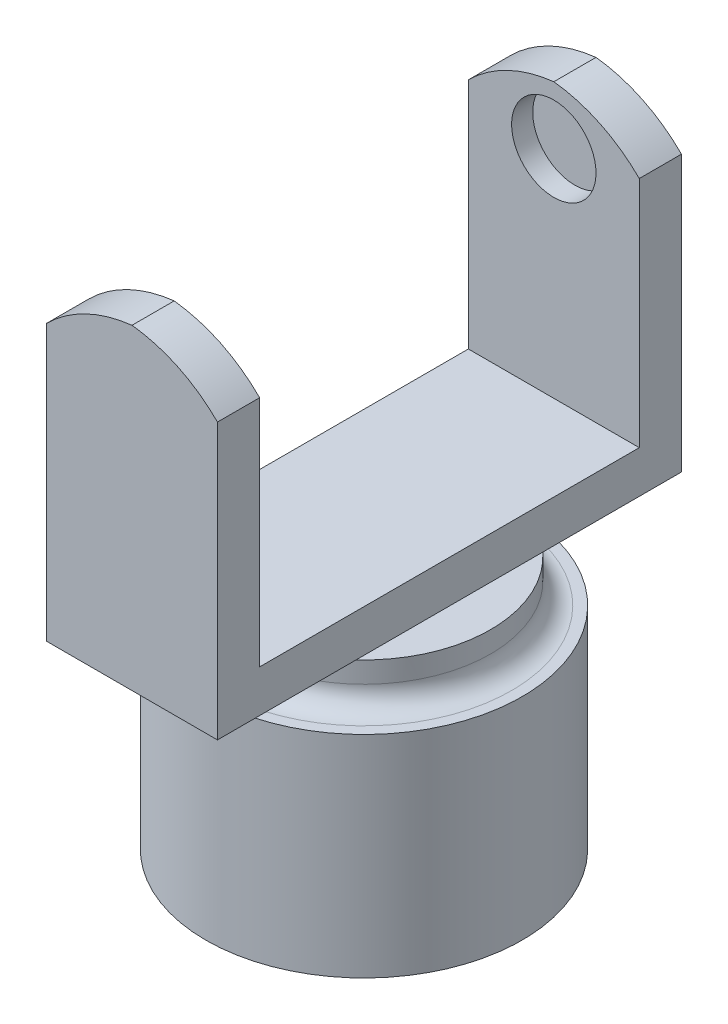
ISO-10303-21;
HEADER;
FILE_DESCRIPTION(('STEP AP214'),'2;1');
FILE_NAME('part.step','',(''),(''),'','','');
FILE_SCHEMA(('AUTOMOTIVE_DESIGN { 1 0 10303 214 1 1 1 1 }'));
ENDSEC;
DATA;
#1=APPLICATION_CONTEXT('core data for automotive mechanical design processes');
#2=APPLICATION_PROTOCOL_DEFINITION('international standard','automotive_design',2000,#1);
#3=PRODUCT_CONTEXT('',#1,'mechanical');
#4=PRODUCT('Part','Part','',(#3));
#5=PRODUCT_RELATED_PRODUCT_CATEGORY('part','',(#4));
#6=PRODUCT_DEFINITION_FORMATION('','',#4);
#7=PRODUCT_DEFINITION_CONTEXT('part definition',#1,'design');
#8=PRODUCT_DEFINITION('design','',#6,#7);
#9=PRODUCT_DEFINITION_SHAPE('','',#8);
#10=(LENGTH_UNIT() NAMED_UNIT(*) SI_UNIT(.MILLI.,.METRE.));
#11=(NAMED_UNIT(*) PLANE_ANGLE_UNIT() SI_UNIT($,.RADIAN.));
#12=(NAMED_UNIT(*) SI_UNIT($,.STERADIAN.) SOLID_ANGLE_UNIT());
#13=UNCERTAINTY_MEASURE_WITH_UNIT(LENGTH_MEASURE(1.E-05),#10,'distance_accuracy_value','');
#14=(GEOMETRIC_REPRESENTATION_CONTEXT(3) GLOBAL_UNCERTAINTY_ASSIGNED_CONTEXT((#13)) GLOBAL_UNIT_ASSIGNED_CONTEXT((#10,
#11,#12)) REPRESENTATION_CONTEXT('',''));
#15=CARTESIAN_POINT('',(0.,0.,0.));
#16=DIRECTION('',(0.,0.,1.));
#17=DIRECTION('',(1.,0.,0.));
#18=AXIS2_PLACEMENT_3D('',#15,#16,#17);
#19=CARTESIAN_POINT('',(-6.,27.,11.));
#20=DIRECTION('',(0.,0.,1.));
#21=DIRECTION('',(0.,-1.,0.));
#22=AXIS2_PLACEMENT_3D('',#19,#20,#21);
#23=PLANE('',#22);
#24=DIRECTION('',(1.,0.,0.));
#25=VECTOR('',#24,1.);
#26=CARTESIAN_POINT('',(-6.,12.,11.));
#27=LINE('',#26,#25);
#28=CARTESIAN_POINT('',(-4.05234317807465,12.,11.));
#29=VERTEX_POINT('',#28);
#30=CARTESIAN_POINT('',(4.05234317807465,12.,11.));
#31=VERTEX_POINT('',#30);
#32=EDGE_CURVE('E206',#29,#31,#27,.T.);
#33=ORIENTED_EDGE('',*,*,#32,.T.);
#34=DIRECTION('',(0.,1.,0.));
#35=VECTOR('',#34,1.);
#36=CARTESIAN_POINT('',(4.05234317807465,27.,11.));
#37=LINE('',#36,#35);
#38=CARTESIAN_POINT('',(4.05234317807465,25.0523431780746,11.));
#39=VERTEX_POINT('',#38);
#40=EDGE_CURVE('E248',#31,#39,#37,.T.);
#41=ORIENTED_EDGE('',*,*,#40,.T.);
#42=CARTESIAN_POINT('',(-0.750000000000014,20.25,11.));
#43=DIRECTION('',(0.,0.,1.));
#44=DIRECTION('',(1.,0.,0.));
#45=AXIS2_PLACEMENT_3D('',#42,#43,#44);
#46=CIRCLE('',#45,6.79153885360307);
#47=CARTESIAN_POINT('',(0.,27.,11.));
#48=VERTEX_POINT('',#47);
#49=EDGE_CURVE('E174',#48,#39,#46,.F.);
#50=ORIENTED_EDGE('',*,*,#49,.F.);
#51=CARTESIAN_POINT('',(0.750000000000014,20.25,11.));
#52=DIRECTION('',(0.,0.,1.));
#53=DIRECTION('',(1.,0.,0.));
#54=AXIS2_PLACEMENT_3D('',#51,#52,#53);
#55=CIRCLE('',#54,6.79153885360307);
#56=CARTESIAN_POINT('',(-4.05234317807465,25.0523431780746,11.));
#57=VERTEX_POINT('',#56);
#58=EDGE_CURVE('E188',#48,#57,#55,.T.);
#59=ORIENTED_EDGE('',*,*,#58,.T.);
#60=DIRECTION('',(0.,1.,0.));
#61=VECTOR('',#60,1.);
#62=CARTESIAN_POINT('',(-4.05234317807465,27.,11.));
#63=LINE('',#62,#61);
#64=EDGE_CURVE('E267',#29,#57,#63,.T.);
#65=ORIENTED_EDGE('',*,*,#64,.F.);
#66=EDGE_LOOP('',(#33,#41,#50,#59,#65));
#67=FACE_BOUND('',#66,.T.);
#68=ADVANCED_FACE('F56',(#67),#23,.T.);
#69=CARTESIAN_POINT('',(-6.,14.,9.));
#70=DIRECTION('',(0.,0.,-1.));
#71=DIRECTION('',(0.,1.,0.));
#72=AXIS2_PLACEMENT_3D('',#69,#70,#71);
#73=PLANE('',#72);
#74=CARTESIAN_POINT('',(0.,24.25,9.));
#75=DIRECTION('',(0.,0.,-1.));
#76=DIRECTION('',(0.,1.,0.));
#77=AXIS2_PLACEMENT_3D('',#74,#75,#76);
#78=CIRCLE('',#77,2.);
#79=CARTESIAN_POINT('',(0.,26.25,9.));
#80=VERTEX_POINT('',#79);
#81=EDGE_CURVE('E181',#80,#80,#78,.F.);
#82=ORIENTED_EDGE('',*,*,#81,.T.);
#83=EDGE_LOOP('',(#82));
#84=FACE_BOUND('',#83,.T.);
#85=CARTESIAN_POINT('',(-0.750000000000014,20.25,9.));
#86=DIRECTION('',(0.,0.,-1.));
#87=DIRECTION('',(0.,1.,0.));
#88=AXIS2_PLACEMENT_3D('',#85,#86,#87);
#89=CIRCLE('',#88,6.79153885360307);
#90=CARTESIAN_POINT('',(4.05234317807465,25.0523431780746,9.));
#91=VERTEX_POINT('',#90);
#92=CARTESIAN_POINT('',(0.,27.,9.00000000000001));
#93=VERTEX_POINT('',#92);
#94=EDGE_CURVE('E178',#91,#93,#89,.F.);
#95=ORIENTED_EDGE('',*,*,#94,.F.);
#96=DIRECTION('',(0.,-1.,0.));
#97=VECTOR('',#96,1.);
#98=CARTESIAN_POINT('',(4.05234317807465,14.,9.));
#99=LINE('',#98,#97);
#100=CARTESIAN_POINT('',(4.05234317807465,14.,9.));
#101=VERTEX_POINT('',#100);
#102=EDGE_CURVE('E79',#91,#101,#99,.T.);
#103=ORIENTED_EDGE('',*,*,#102,.T.);
#104=DIRECTION('',(1.,0.,0.));
#105=VECTOR('',#104,1.);
#106=CARTESIAN_POINT('',(-6.,14.,9.));
#107=LINE('',#106,#105);
#108=CARTESIAN_POINT('',(-4.05234317807465,14.,9.));
#109=VERTEX_POINT('',#108);
#110=EDGE_CURVE('E211',#109,#101,#107,.T.);
#111=ORIENTED_EDGE('',*,*,#110,.F.);
#112=DIRECTION('',(0.,-1.,0.));
#113=VECTOR('',#112,1.);
#114=CARTESIAN_POINT('',(-4.05234317807465,14.,9.));
#115=LINE('',#114,#113);
#116=CARTESIAN_POINT('',(-4.05234317807465,25.0523431780746,9.00000000000001));
#117=VERTEX_POINT('',#116);
#118=EDGE_CURVE('E270',#117,#109,#115,.T.);
#119=ORIENTED_EDGE('',*,*,#118,.F.);
#120=CARTESIAN_POINT('',(0.750000000000014,20.25,9.));
#121=DIRECTION('',(0.,0.,-1.));
#122=DIRECTION('',(0.,1.,0.));
#123=AXIS2_PLACEMENT_3D('',#120,#121,#122);
#124=CIRCLE('',#123,6.79153885360307);
#125=EDGE_CURVE('E202',#117,#93,#124,.T.);
#126=ORIENTED_EDGE('',*,*,#125,.T.);
#127=EDGE_LOOP('',(#95,#103,#111,#119,#126));
#128=FACE_BOUND('',#127,.T.);
#129=ADVANCED_FACE('F330',(#84,#128),#73,.T.);
#130=CARTESIAN_POINT('',(-6.,27.,-9.));
#131=DIRECTION('',(0.,0.,1.));
#132=DIRECTION('',(1.,0.,0.));
#133=AXIS2_PLACEMENT_3D('',#130,#131,#132);
#134=PLANE('',#133);
#135=CARTESIAN_POINT('',(0.,24.25,-9.));
#136=DIRECTION('',(0.,0.,1.));
#137=DIRECTION('',(1.,0.,0.));
#138=AXIS2_PLACEMENT_3D('',#135,#136,#137);
#139=CIRCLE('',#138,2.);
#140=CARTESIAN_POINT('',(2.,24.25,-9.));
#141=VERTEX_POINT('',#140);
#142=EDGE_CURVE('E242',#141,#141,#139,.F.);
#143=ORIENTED_EDGE('',*,*,#142,.T.);
#144=EDGE_LOOP('',(#143));
#145=FACE_BOUND('',#144,.T.);
#146=DIRECTION('',(1.,0.,0.));
#147=VECTOR('',#146,1.);
#148=CARTESIAN_POINT('',(-6.,14.,-9.));
#149=LINE('',#148,#147);
#150=CARTESIAN_POINT('',(-4.05234317807465,14.,-9.));
#151=VERTEX_POINT('',#150);
#152=CARTESIAN_POINT('',(4.05234317807465,14.,-9.));
#153=VERTEX_POINT('',#152);
#154=EDGE_CURVE('E215',#151,#153,#149,.T.);
#155=ORIENTED_EDGE('',*,*,#154,.T.);
#156=DIRECTION('',(0.,1.,0.));
#157=VECTOR('',#156,1.);
#158=CARTESIAN_POINT('',(4.05234317807465,27.,-9.));
#159=LINE('',#158,#157);
#160=CARTESIAN_POINT('',(4.05234317807465,25.0523431780746,-9.));
#161=VERTEX_POINT('',#160);
#162=EDGE_CURVE('E285',#153,#161,#159,.T.);
#163=ORIENTED_EDGE('',*,*,#162,.T.);
#164=CARTESIAN_POINT('',(-0.750000000000014,20.25,-9.));
#165=DIRECTION('',(0.,0.,1.));
#166=DIRECTION('',(1.,0.,0.));
#167=AXIS2_PLACEMENT_3D('',#164,#165,#166);
#168=CIRCLE('',#167,6.79153885360307);
#169=CARTESIAN_POINT('',(0.,27.,-9.));
#170=VERTEX_POINT('',#169);
#171=EDGE_CURVE('E166',#170,#161,#168,.F.);
#172=ORIENTED_EDGE('',*,*,#171,.F.);
#173=CARTESIAN_POINT('',(0.750000000000014,20.25,-9.));
#174=DIRECTION('',(0.,0.,1.));
#175=DIRECTION('',(1.,0.,0.));
#176=AXIS2_PLACEMENT_3D('',#173,#174,#175);
#177=CIRCLE('',#176,6.79153885360307);
#178=CARTESIAN_POINT('',(-4.05234317807465,25.0523431780746,-9.));
#179=VERTEX_POINT('',#178);
#180=EDGE_CURVE('E198',#170,#179,#177,.T.);
#181=ORIENTED_EDGE('',*,*,#180,.T.);
#182=DIRECTION('',(0.,1.,0.));
#183=VECTOR('',#182,1.);
#184=CARTESIAN_POINT('',(-4.05234317807465,27.,-9.));
#185=LINE('',#184,#183);
#186=EDGE_CURVE('E71',#151,#179,#185,.T.);
#187=ORIENTED_EDGE('',*,*,#186,.F.);
#188=EDGE_LOOP('',(#155,#163,#172,#181,#187));
#189=FACE_BOUND('',#188,.T.);
#190=ADVANCED_FACE('F357',(#145,#189),#134,.T.);
#191=CARTESIAN_POINT('',(-6.,12.,-11.));
#192=DIRECTION('',(0.,0.,-1.));
#193=DIRECTION('',(-1.,0.,0.));
#194=AXIS2_PLACEMENT_3D('',#191,#192,#193);
#195=PLANE('',#194);
#196=CARTESIAN_POINT('',(-0.750000000000014,20.25,-11.));
#197=DIRECTION('',(0.,0.,-1.));
#198=DIRECTION('',(-1.,0.,0.));
#199=AXIS2_PLACEMENT_3D('',#196,#197,#198);
#200=CIRCLE('',#199,6.79153885360307);
#201=CARTESIAN_POINT('',(4.05234317807465,25.0523431780746,-11.));
#202=VERTEX_POINT('',#201);
#203=CARTESIAN_POINT('',(0.,27.,-11.));
#204=VERTEX_POINT('',#203);
#205=EDGE_CURVE('E163',#202,#204,#200,.F.);
#206=ORIENTED_EDGE('',*,*,#205,.F.);
#207=DIRECTION('',(0.,-1.,0.));
#208=VECTOR('',#207,1.);
#209=CARTESIAN_POINT('',(4.05234317807465,0.,-11.));
#210=LINE('',#209,#208);
#211=CARTESIAN_POINT('',(4.05234317807465,12.,-11.));
#212=VERTEX_POINT('',#211);
#213=EDGE_CURVE('E143',#202,#212,#210,.T.);
#214=ORIENTED_EDGE('',*,*,#213,.T.);
#215=DIRECTION('',(1.,0.,0.));
#216=VECTOR('',#215,1.);
#217=CARTESIAN_POINT('',(-6.,12.,-11.));
#218=LINE('',#217,#216);
#219=CARTESIAN_POINT('',(-4.05234317807465,12.,-11.));
#220=VERTEX_POINT('',#219);
#221=EDGE_CURVE('E205',#220,#212,#218,.T.);
#222=ORIENTED_EDGE('',*,*,#221,.F.);
#223=DIRECTION('',(0.,-1.,0.));
#224=VECTOR('',#223,1.);
#225=CARTESIAN_POINT('',(-4.05234317807465,0.,-11.));
#226=LINE('',#225,#224);
#227=CARTESIAN_POINT('',(-4.05234317807465,25.0523431780746,-11.));
#228=VERTEX_POINT('',#227);
#229=EDGE_CURVE('E298',#228,#220,#226,.T.);
#230=ORIENTED_EDGE('',*,*,#229,.F.);
#231=CARTESIAN_POINT('',(0.750000000000014,20.25,-11.));
#232=DIRECTION('',(0.,0.,-1.));
#233=DIRECTION('',(-1.,0.,0.));
#234=AXIS2_PLACEMENT_3D('',#231,#232,#233);
#235=CIRCLE('',#234,6.79153885360307);
#236=EDGE_CURVE('E172',#228,#204,#235,.T.);
#237=ORIENTED_EDGE('',*,*,#236,.T.);
#238=EDGE_LOOP('',(#206,#214,#222,#230,#237));
#239=FACE_BOUND('',#238,.T.);
#240=ADVANCED_FACE('F169',(#239),#195,.T.);
#241=CARTESIAN_POINT('',(-6.,12.,-6.));
#242=DIRECTION('',(0.,-1.,0.));
#243=DIRECTION('',(0.,0.,-1.));
#244=AXIS2_PLACEMENT_3D('',#241,#242,#243);
#245=PLANE('',#244);
#246=ORIENTED_EDGE('',*,*,#221,.T.);
#247=DIRECTION('',(0.,0.,-1.));
#248=VECTOR('',#247,1.);
#249=CARTESIAN_POINT('',(4.05234317807465,12.,25.));
#250=LINE('',#249,#248);
#251=CARTESIAN_POINT('',(4.05234317807465,12.,-4.42476154918114));
#252=VERTEX_POINT('',#251);
#253=EDGE_CURVE('E151',#252,#212,#250,.T.);
#254=ORIENTED_EDGE('',*,*,#253,.F.);
#255=CARTESIAN_POINT('',(0.,12.,0.));
#256=DIRECTION('',(0.,1.,0.));
#257=DIRECTION('',(0.,0.,1.));
#258=AXIS2_PLACEMENT_3D('',#255,#256,#257);
#259=CIRCLE('',#258,6.);
#260=CARTESIAN_POINT('',(-4.05234317807465,12.,-4.42476154918114));
#261=VERTEX_POINT('',#260);
#262=EDGE_CURVE('E225',#252,#261,#259,.T.);
#263=ORIENTED_EDGE('',*,*,#262,.T.);
#264=DIRECTION('',(0.,0.,-1.));
#265=VECTOR('',#264,1.);
#266=CARTESIAN_POINT('',(-4.05234317807465,12.,25.));
#267=LINE('',#266,#265);
#268=EDGE_CURVE('E292',#261,#220,#267,.T.);
#269=ORIENTED_EDGE('',*,*,#268,.T.);
#270=EDGE_LOOP('',(#246,#254,#263,#269));
#271=FACE_BOUND('',#270,.T.);
#272=ADVANCED_FACE('F360',(#271),#245,.T.);
#273=CARTESIAN_POINT('',(-4.05234317807465,12.,4.42476154918114));
#274=VERTEX_POINT('',#273);
#275=CARTESIAN_POINT('',(4.05234317807465,12.,4.42476154918114));
#276=VERTEX_POINT('',#275);
#277=EDGE_CURVE('E210',#274,#276,#259,.T.);
#278=ORIENTED_EDGE('',*,*,#277,.T.);
#279=EDGE_CURVE('E277',#31,#276,#250,.T.);
#280=ORIENTED_EDGE('',*,*,#279,.F.);
#281=ORIENTED_EDGE('',*,*,#32,.F.);
#282=EDGE_CURVE('E157',#29,#274,#267,.T.);
#283=ORIENTED_EDGE('',*,*,#282,.T.);
#284=EDGE_LOOP('',(#278,#280,#281,#283));
#285=FACE_BOUND('',#284,.T.);
#286=ADVANCED_FACE('F275',(#285),#245,.T.);
#287=CARTESIAN_POINT('',(-6.,14.,-9.));
#288=DIRECTION('',(0.,1.,0.));
#289=DIRECTION('',(0.,0.,1.));
#290=AXIS2_PLACEMENT_3D('',#287,#288,#289);
#291=PLANE('',#290);
#292=ORIENTED_EDGE('',*,*,#110,.T.);
#293=DIRECTION('',(0.,0.,-1.));
#294=VECTOR('',#293,1.);
#295=CARTESIAN_POINT('',(4.05234317807465,14.,-9.));
#296=LINE('',#295,#294);
#297=EDGE_CURVE('E279',#101,#153,#296,.T.);
#298=ORIENTED_EDGE('',*,*,#297,.T.);
#299=ORIENTED_EDGE('',*,*,#154,.F.);
#300=DIRECTION('',(0.,0.,-1.));
#301=VECTOR('',#300,1.);
#302=CARTESIAN_POINT('',(-4.05234317807465,14.,-9.));
#303=LINE('',#302,#301);
#304=EDGE_CURVE('E258',#109,#151,#303,.T.);
#305=ORIENTED_EDGE('',*,*,#304,.F.);
#306=EDGE_LOOP('',(#292,#298,#299,#305));
#307=FACE_BOUND('',#306,.T.);
#308=ADVANCED_FACE('F363',(#307),#291,.T.);
#309=CARTESIAN_POINT('',(-0.750000000000014,20.25,-18.));
#310=DIRECTION('',(0.,0.,1.));
#311=DIRECTION('',(1.,0.,0.));
#312=AXIS2_PLACEMENT_3D('',#309,#310,#311);
#313=CYLINDRICAL_SURFACE('',#312,6.79153885360307);
#314=DIRECTION('',(0.,0.,-1.));
#315=VECTOR('',#314,1.);
#316=CARTESIAN_POINT('',(4.05234317807465,25.0523431780746,25.));
#317=LINE('',#316,#315);
#318=EDGE_CURVE('E147',#161,#202,#317,.T.);
#319=ORIENTED_EDGE('',*,*,#318,.T.);
#320=ORIENTED_EDGE('',*,*,#205,.T.);
#321=DIRECTION('',(0.,0.,1.));
#322=VECTOR('',#321,1.);
#323=CARTESIAN_POINT('',(0.,27.,-18.));
#324=LINE('',#323,#322);
#325=EDGE_CURVE('E195',#204,#170,#324,.T.);
#326=ORIENTED_EDGE('',*,*,#325,.T.);
#327=ORIENTED_EDGE('',*,*,#171,.T.);
#328=EDGE_LOOP('',(#319,#320,#326,#327));
#329=FACE_BOUND('',#328,.T.);
#330=ADVANCED_FACE('F162',(#329),#313,.T.);
#331=DIRECTION('',(0.,0.,1.));
#332=VECTOR('',#331,1.);
#333=CARTESIAN_POINT('',(4.05234317807465,25.0523431780746,-18.));
#334=LINE('',#333,#332);
#335=EDGE_CURVE('E65',#91,#39,#334,.T.);
#336=ORIENTED_EDGE('',*,*,#335,.F.);
#337=ORIENTED_EDGE('',*,*,#94,.T.);
#338=EDGE_CURVE('E192',#93,#48,#324,.T.);
#339=ORIENTED_EDGE('',*,*,#338,.T.);
#340=ORIENTED_EDGE('',*,*,#49,.T.);
#341=EDGE_LOOP('',(#336,#337,#339,#340));
#342=FACE_BOUND('',#341,.T.);
#343=ADVANCED_FACE('F260',(#342),#313,.T.);
#344=CARTESIAN_POINT('',(0.,10.,0.));
#345=DIRECTION('',(0.,-1.,0.));
#346=DIRECTION('',(0.,0.,-1.));
#347=AXIS2_PLACEMENT_3D('',#344,#345,#346);
#348=CYLINDRICAL_SURFACE('',#347,7.5);
#349=CARTESIAN_POINT('',(0.,10.,0.));
#350=DIRECTION('',(0.,1.,0.));
#351=DIRECTION('',(0.,0.,1.));
#352=AXIS2_PLACEMENT_3D('',#349,#350,#351);
#353=CIRCLE('',#352,7.5);
#354=CARTESIAN_POINT('',(0.,10.,7.5));
#355=VERTEX_POINT('',#354);
#356=EDGE_CURVE('E227',#355,#355,#353,.T.);
#357=ORIENTED_EDGE('',*,*,#356,.F.);
#358=EDGE_LOOP('',(#357));
#359=FACE_BOUND('',#358,.T.);
#360=CARTESIAN_POINT('',(0.,0.,0.));
#361=DIRECTION('',(0.,1.,0.));
#362=DIRECTION('',(0.,0.,1.));
#363=AXIS2_PLACEMENT_3D('',#360,#361,#362);
#364=CIRCLE('',#363,7.5);
#365=CARTESIAN_POINT('',(0.,0.,7.5));
#366=VERTEX_POINT('',#365);
#367=EDGE_CURVE('E224',#366,#366,#364,.T.);
#368=ORIENTED_EDGE('',*,*,#367,.T.);
#369=EDGE_LOOP('',(#368));
#370=FACE_BOUND('',#369,.T.);
#371=ADVANCED_FACE('F380',(#359,#370),#348,.T.);
#372=CARTESIAN_POINT('',(0.,10.,0.));
#373=DIRECTION('',(0.,1.,0.));
#374=DIRECTION('',(0.,0.,1.));
#375=AXIS2_PLACEMENT_3D('',#372,#373,#374);
#376=PLANE('',#375);
#377=CARTESIAN_POINT('',(0.,10.,0.));
#378=DIRECTION('',(0.,1.,0.));
#379=DIRECTION('',(0.,0.,1.));
#380=AXIS2_PLACEMENT_3D('',#377,#378,#379);
#381=CIRCLE('',#380,7.);
#382=CARTESIAN_POINT('',(0.,10.,7.));
#383=VERTEX_POINT('',#382);
#384=EDGE_CURVE('E238',#383,#383,#381,.F.);
#385=ORIENTED_EDGE('',*,*,#384,.T.);
#386=EDGE_LOOP('',(#385));
#387=FACE_BOUND('',#386,.T.);
#388=ORIENTED_EDGE('',*,*,#356,.T.);
#389=EDGE_LOOP('',(#388));
#390=FACE_BOUND('',#389,.T.);
#391=ADVANCED_FACE('F377',(#387,#390),#376,.T.);
#392=CARTESIAN_POINT('',(0.,0.,0.));
#393=DIRECTION('',(0.,1.,0.));
#394=DIRECTION('',(0.,0.,1.));
#395=AXIS2_PLACEMENT_3D('',#392,#393,#394);
#396=PLANE('',#395);
#397=CARTESIAN_POINT('',(0.,0.,0.));
#398=DIRECTION('',(0.,-1.,0.));
#399=DIRECTION('',(0.,0.,-1.));
#400=AXIS2_PLACEMENT_3D('',#397,#398,#399);
#401=CIRCLE('',#400,5.);
#402=CARTESIAN_POINT('',(0.,0.,-5.));
#403=VERTEX_POINT('',#402);
#404=EDGE_CURVE('E269',#403,#403,#401,.T.);
#405=ORIENTED_EDGE('',*,*,#404,.F.);
#406=EDGE_LOOP('',(#405));
#407=FACE_BOUND('',#406,.T.);
#408=ORIENTED_EDGE('',*,*,#367,.F.);
#409=EDGE_LOOP('',(#408));
#410=FACE_BOUND('',#409,.T.);
#411=ADVANCED_FACE('F375',(#407,#410),#396,.F.);
#412=CARTESIAN_POINT('',(0.,12.,0.));
#413=DIRECTION('',(0.,-1.,0.));
#414=DIRECTION('',(0.,0.,-1.));
#415=AXIS2_PLACEMENT_3D('',#412,#413,#414);
#416=CYLINDRICAL_SURFACE('',#415,6.);
#417=CARTESIAN_POINT('',(0.,11.,0.));
#418=DIRECTION('',(0.,1.,0.));
#419=DIRECTION('',(0.,0.,1.));
#420=AXIS2_PLACEMENT_3D('',#417,#418,#419);
#421=CIRCLE('',#420,6.);
#422=CARTESIAN_POINT('',(0.,11.,6.));
#423=VERTEX_POINT('',#422);
#424=EDGE_CURVE('E231',#423,#423,#421,.T.);
#425=ORIENTED_EDGE('',*,*,#424,.T.);
#426=EDGE_LOOP('',(#425));
#427=FACE_BOUND('',#426,.T.);
#428=EDGE_CURVE('E221',#276,#252,#259,.T.);
#429=ORIENTED_EDGE('',*,*,#428,.F.);
#430=ORIENTED_EDGE('',*,*,#277,.F.);
#431=EDGE_CURVE('E226',#261,#274,#259,.T.);
#432=ORIENTED_EDGE('',*,*,#431,.F.);
#433=ORIENTED_EDGE('',*,*,#262,.F.);
#434=EDGE_LOOP('',(#429,#430,#432,#433));
#435=FACE_BOUND('',#434,.T.);
#436=ADVANCED_FACE('F372',(#427,#435),#416,.T.);
#437=CARTESIAN_POINT('',(0.,11.,0.));
#438=DIRECTION('',(0.,1.,0.));
#439=DIRECTION('',(0.,0.,1.));
#440=AXIS2_PLACEMENT_3D('',#437,#438,#439);
#441=TOROIDAL_SURFACE('',#440,7.,1.);
#442=ORIENTED_EDGE('',*,*,#384,.F.);
#443=EDGE_LOOP('',(#442));
#444=FACE_BOUND('',#443,.T.);
#445=ORIENTED_EDGE('',*,*,#424,.F.);
#446=EDGE_LOOP('',(#445));
#447=FACE_BOUND('',#446,.T.);
#448=ADVANCED_FACE('F58',(#444,#447),#441,.F.);
#449=CARTESIAN_POINT('',(0.750000000000014,20.25,-18.));
#450=DIRECTION('',(0.,0.,1.));
#451=DIRECTION('',(1.,0.,0.));
#452=AXIS2_PLACEMENT_3D('',#449,#450,#451);
#453=CYLINDRICAL_SURFACE('',#452,6.79153885360307);
#454=DIRECTION('',(0.,0.,-1.));
#455=VECTOR('',#454,1.);
#456=CARTESIAN_POINT('',(-4.05234317807465,25.0523431780746,25.));
#457=LINE('',#456,#455);
#458=EDGE_CURVE('E266',#57,#117,#457,.T.);
#459=ORIENTED_EDGE('',*,*,#458,.F.);
#460=ORIENTED_EDGE('',*,*,#58,.F.);
#461=ORIENTED_EDGE('',*,*,#338,.F.);
#462=ORIENTED_EDGE('',*,*,#125,.F.);
#463=EDGE_LOOP('',(#459,#460,#461,#462));
#464=FACE_BOUND('',#463,.T.);
#465=ADVANCED_FACE('F265',(#464),#453,.T.);
#466=DIRECTION('',(0.,0.,1.));
#467=VECTOR('',#466,1.);
#468=CARTESIAN_POINT('',(-4.05234317807465,25.0523431780746,-18.));
#469=LINE('',#468,#467);
#470=EDGE_CURVE('E12',#179,#228,#469,.F.);
#471=ORIENTED_EDGE('',*,*,#470,.F.);
#472=ORIENTED_EDGE('',*,*,#180,.F.);
#473=ORIENTED_EDGE('',*,*,#325,.F.);
#474=ORIENTED_EDGE('',*,*,#236,.F.);
#475=EDGE_LOOP('',(#471,#472,#473,#474));
#476=FACE_BOUND('',#475,.T.);
#477=ADVANCED_FACE('F398',(#476),#453,.T.);
#478=CARTESIAN_POINT('',(0.,24.25,-10.));
#479=DIRECTION('',(0.,0.,-1.));
#480=DIRECTION('',(0.,1.,0.));
#481=AXIS2_PLACEMENT_3D('',#478,#479,#480);
#482=PLANE('',#481);
#483=CARTESIAN_POINT('',(0.,24.25,-10.));
#484=DIRECTION('',(0.,0.,-1.));
#485=DIRECTION('',(0.,1.,0.));
#486=AXIS2_PLACEMENT_3D('',#483,#484,#485);
#487=CIRCLE('',#486,2.);
#488=CARTESIAN_POINT('',(0.,26.25,-10.));
#489=VERTEX_POINT('',#488);
#490=EDGE_CURVE('E245',#489,#489,#487,.T.);
#491=ORIENTED_EDGE('',*,*,#490,.F.);
#492=EDGE_LOOP('',(#491));
#493=FACE_BOUND('',#492,.T.);
#494=ADVANCED_FACE('F400',(#493),#482,.F.);
#495=CARTESIAN_POINT('',(0.,24.25,-10.));
#496=DIRECTION('',(0.,0.,1.));
#497=DIRECTION('',(0.,-1.,0.));
#498=AXIS2_PLACEMENT_3D('',#495,#496,#497);
#499=CYLINDRICAL_SURFACE('',#498,2.);
#500=ORIENTED_EDGE('',*,*,#142,.F.);
#501=EDGE_LOOP('',(#500));
#502=FACE_BOUND('',#501,.T.);
#503=ORIENTED_EDGE('',*,*,#490,.T.);
#504=EDGE_LOOP('',(#503));
#505=FACE_BOUND('',#504,.T.);
#506=ADVANCED_FACE('F337',(#502,#505),#499,.F.);
#507=ORIENTED_EDGE('',*,*,#81,.F.);
#508=EDGE_LOOP('',(#507));
#509=FACE_BOUND('',#508,.T.);
#510=CARTESIAN_POINT('',(0.,24.25,10.));
#511=DIRECTION('',(0.,0.,-1.));
#512=DIRECTION('',(0.,1.,0.));
#513=AXIS2_PLACEMENT_3D('',#510,#511,#512);
#514=CIRCLE('',#513,2.);
#515=CARTESIAN_POINT('',(0.,26.25,10.));
#516=VERTEX_POINT('',#515);
#517=EDGE_CURVE('E317',#516,#516,#514,.T.);
#518=ORIENTED_EDGE('',*,*,#517,.F.);
#519=EDGE_LOOP('',(#518));
#520=FACE_BOUND('',#519,.T.);
#521=ADVANCED_FACE('F333',(#509,#520),#499,.F.);
#522=CARTESIAN_POINT('',(0.,24.25,10.));
#523=DIRECTION('',(0.,0.,-1.));
#524=DIRECTION('',(0.,1.,0.));
#525=AXIS2_PLACEMENT_3D('',#522,#523,#524);
#526=PLANE('',#525);
#527=ORIENTED_EDGE('',*,*,#517,.T.);
#528=EDGE_LOOP('',(#527));
#529=FACE_BOUND('',#528,.T.);
#530=ADVANCED_FACE('F336',(#529),#526,.T.);
#531=CARTESIAN_POINT('',(0.,7.,0.));
#532=DIRECTION('',(0.,-1.,0.));
#533=DIRECTION('',(0.,0.,-1.));
#534=AXIS2_PLACEMENT_3D('',#531,#532,#533);
#535=CYLINDRICAL_SURFACE('',#534,5.);
#536=CARTESIAN_POINT('',(0.,7.,0.));
#537=DIRECTION('',(0.,-1.,0.));
#538=DIRECTION('',(0.,0.,-1.));
#539=AXIS2_PLACEMENT_3D('',#536,#537,#538);
#540=CIRCLE('',#539,5.);
#541=CARTESIAN_POINT('',(0.,7.,-5.));
#542=VERTEX_POINT('',#541);
#543=EDGE_CURVE('E313',#542,#542,#540,.T.);
#544=ORIENTED_EDGE('',*,*,#543,.F.);
#545=EDGE_LOOP('',(#544));
#546=FACE_BOUND('',#545,.T.);
#547=ORIENTED_EDGE('',*,*,#404,.T.);
#548=EDGE_LOOP('',(#547));
#549=FACE_BOUND('',#548,.T.);
#550=ADVANCED_FACE('F342',(#546,#549),#535,.F.);
#551=CARTESIAN_POINT('',(0.,7.,0.));
#552=DIRECTION('',(0.,-1.,0.));
#553=DIRECTION('',(0.,0.,-1.));
#554=AXIS2_PLACEMENT_3D('',#551,#552,#553);
#555=PLANE('',#554);
#556=ORIENTED_EDGE('',*,*,#543,.T.);
#557=EDGE_LOOP('',(#556));
#558=FACE_BOUND('',#557,.T.);
#559=ADVANCED_FACE('F347',(#558),#555,.T.);
#560=CARTESIAN_POINT('',(0.,12.,25.));
#561=DIRECTION('',(0.,-1.,0.));
#562=DIRECTION('',(0.,0.,-1.));
#563=AXIS2_PLACEMENT_3D('',#560,#561,#562);
#564=PLANE('',#563);
#565=ORIENTED_EDGE('',*,*,#428,.T.);
#566=EDGE_CURVE('E280',#276,#252,#250,.T.);
#567=ORIENTED_EDGE('',*,*,#566,.F.);
#568=EDGE_LOOP('',(#565,#567));
#569=FACE_BOUND('',#568,.T.);
#570=ADVANCED_FACE('F426',(#569),#564,.F.);
#571=CARTESIAN_POINT('',(4.05234317807465,0.,25.));
#572=DIRECTION('',(1.,0.,0.));
#573=DIRECTION('',(0.,0.,-1.));
#574=AXIS2_PLACEMENT_3D('',#571,#572,#573);
#575=PLANE('',#574);
#576=ORIENTED_EDGE('',*,*,#279,.T.);
#577=ORIENTED_EDGE('',*,*,#566,.T.);
#578=ORIENTED_EDGE('',*,*,#253,.T.);
#579=ORIENTED_EDGE('',*,*,#213,.F.);
#580=ORIENTED_EDGE('',*,*,#318,.F.);
#581=ORIENTED_EDGE('',*,*,#162,.F.);
#582=ORIENTED_EDGE('',*,*,#297,.F.);
#583=ORIENTED_EDGE('',*,*,#102,.F.);
#584=ORIENTED_EDGE('',*,*,#335,.T.);
#585=ORIENTED_EDGE('',*,*,#40,.F.);
#586=EDGE_LOOP('',(#576,#577,#578,#579,#580,#581,#582,#583,#584,#585));
#587=FACE_BOUND('',#586,.T.);
#588=ADVANCED_FACE('F146',(#587),#575,.T.);
#589=CARTESIAN_POINT('',(0.,12.,25.));
#590=DIRECTION('',(0.,-1.,0.));
#591=DIRECTION('',(0.,0.,-1.));
#592=AXIS2_PLACEMENT_3D('',#589,#590,#591);
#593=PLANE('',#592);
#594=EDGE_CURVE('E290',#274,#261,#267,.T.);
#595=ORIENTED_EDGE('',*,*,#594,.T.);
#596=ORIENTED_EDGE('',*,*,#431,.T.);
#597=EDGE_LOOP('',(#595,#596));
#598=FACE_BOUND('',#597,.T.);
#599=ADVANCED_FACE('F416',(#598),#593,.F.);
#600=CARTESIAN_POINT('',(-4.05234317807465,0.,25.));
#601=DIRECTION('',(1.,0.,0.));
#602=DIRECTION('',(0.,0.,-1.));
#603=AXIS2_PLACEMENT_3D('',#600,#601,#602);
#604=PLANE('',#603);
#605=ORIENTED_EDGE('',*,*,#64,.T.);
#606=ORIENTED_EDGE('',*,*,#458,.T.);
#607=ORIENTED_EDGE('',*,*,#118,.T.);
#608=ORIENTED_EDGE('',*,*,#304,.T.);
#609=ORIENTED_EDGE('',*,*,#186,.T.);
#610=ORIENTED_EDGE('',*,*,#470,.T.);
#611=ORIENTED_EDGE('',*,*,#229,.T.);
#612=ORIENTED_EDGE('',*,*,#268,.F.);
#613=ORIENTED_EDGE('',*,*,#594,.F.);
#614=ORIENTED_EDGE('',*,*,#282,.F.);
#615=EDGE_LOOP('',(#605,#606,#607,#608,#609,#610,#611,#612,#613,#614));
#616=FACE_BOUND('',#615,.T.);
#617=ADVANCED_FACE('F414',(#616),#604,.F.);
#618=CLOSED_SHELL('',(#68,#129,#190,#240,#272,#286,#308,#330,#343,#371,#391,#411,#436,#448,#465,
#477,#494,#506,#521,#530,#550,#559,#570,#588,#599,#617));
#619=MANIFOLD_SOLID_BREP('B2',#618);
#620=ADVANCED_BREP_SHAPE_REPRESENTATION('',(#18,#619),#14);
#621=SHAPE_DEFINITION_REPRESENTATION(#9,#620);
ENDSEC;
END-ISO-10303-21;
